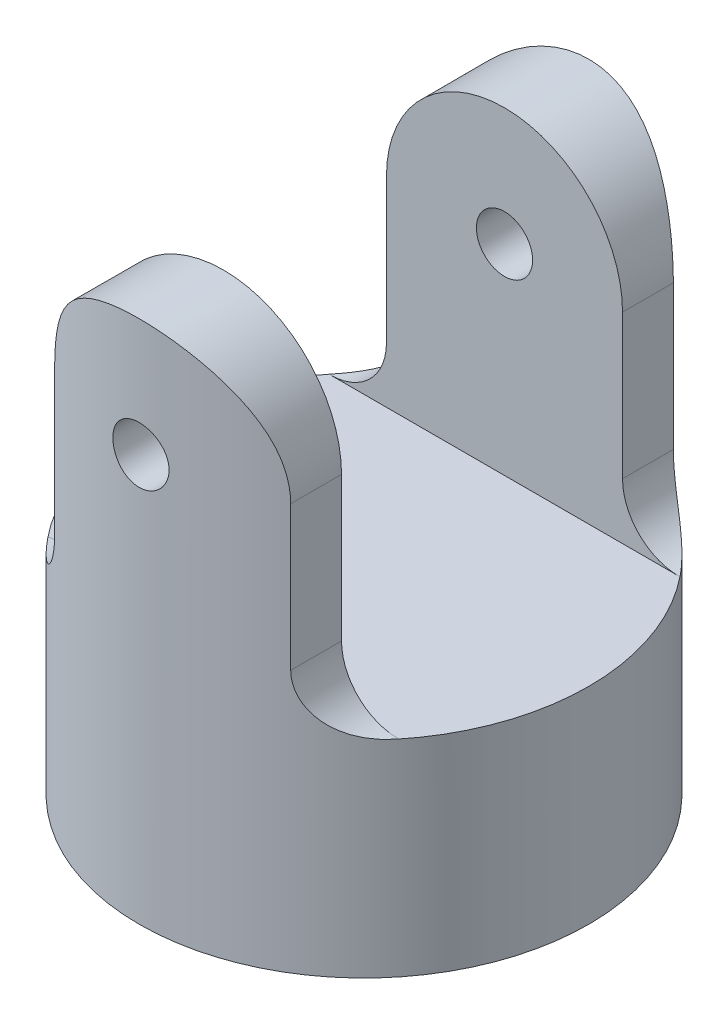
ISO-10303-21;
HEADER;
FILE_DESCRIPTION(('STEP AP214'),'2;1');
FILE_NAME('part.step','',(''),(''),'','','');
FILE_SCHEMA(('AUTOMOTIVE_DESIGN { 1 0 10303 214 1 1 1 1 }'));
ENDSEC;
DATA;
#1=APPLICATION_CONTEXT('core data for automotive mechanical design processes');
#2=APPLICATION_PROTOCOL_DEFINITION('international standard','automotive_design',2000,#1);
#3=PRODUCT_CONTEXT('',#1,'mechanical');
#4=PRODUCT('Part','Part','',(#3));
#5=PRODUCT_RELATED_PRODUCT_CATEGORY('part','',(#4));
#6=PRODUCT_DEFINITION_FORMATION('','',#4);
#7=PRODUCT_DEFINITION_CONTEXT('part definition',#1,'design');
#8=PRODUCT_DEFINITION('design','',#6,#7);
#9=PRODUCT_DEFINITION_SHAPE('','',#8);
#10=(LENGTH_UNIT() NAMED_UNIT(*) SI_UNIT(.MILLI.,.METRE.));
#11=(NAMED_UNIT(*) PLANE_ANGLE_UNIT() SI_UNIT($,.RADIAN.));
#12=(NAMED_UNIT(*) SI_UNIT($,.STERADIAN.) SOLID_ANGLE_UNIT());
#13=UNCERTAINTY_MEASURE_WITH_UNIT(LENGTH_MEASURE(1.E-05),#10,'distance_accuracy_value','');
#14=(GEOMETRIC_REPRESENTATION_CONTEXT(3) GLOBAL_UNCERTAINTY_ASSIGNED_CONTEXT((#13)) GLOBAL_UNIT_ASSIGNED_CONTEXT((#10,
#11,#12)) REPRESENTATION_CONTEXT('',''));
#15=CARTESIAN_POINT('',(0.,0.,0.));
#16=DIRECTION('',(0.,0.,1.));
#17=DIRECTION('',(1.,0.,0.));
#18=AXIS2_PLACEMENT_3D('',#15,#16,#17);
#19=CARTESIAN_POINT('',(0.,14.,0.));
#20=DIRECTION('',(0.,-1.,0.));
#21=DIRECTION('',(0.,0.,-1.));
#22=AXIS2_PLACEMENT_3D('',#19,#20,#21);
#23=CYLINDRICAL_SURFACE('',#22,6.);
#24=CARTESIAN_POINT('',(0.,11.6,-6.));
#25=CARTESIAN_POINT('',(-0.0419523286667284,11.5999982177193,-5.99999941468929));
#26=CARTESIAN_POINT('',(-0.083930872290824,11.5964681362492,-5.99955535366471));
#27=CARTESIAN_POINT('',(-0.166719840626926,11.5824416736288,-5.99782662033408));
#28=CARTESIAN_POINT('',(-0.207528999187123,11.571938018623,-5.99654107032429));
#29=CARTESIAN_POINT('',(-0.286768672443916,11.5442787068258,-5.99327418313322));
#30=CARTESIAN_POINT('',(-0.325200768043841,11.527127527457,-5.99129331436663));
#31=CARTESIAN_POINT('',(-0.39863384246791,11.4866698148091,-5.98685610263429));
#32=CARTESIAN_POINT('',(-0.433635408466911,11.4633643374408,-5.98439984125235));
#33=CARTESIAN_POINT('',(-0.499413845079395,11.4111224150481,-5.97927096391898));
#34=CARTESIAN_POINT('',(-0.530169109481138,11.3821588611961,-5.97659734407725));
#35=CARTESIAN_POINT('',(-0.586395838067248,11.319481152939,-5.97134317802925));
#36=CARTESIAN_POINT('',(-0.611867032917675,11.285766756526,-5.96876263657281));
#37=CARTESIAN_POINT('',(-0.656883048385181,11.2144040067303,-5.96397691685876));
#38=CARTESIAN_POINT('',(-0.676407628782321,11.1767427915296,-5.96177303153373));
#39=CARTESIAN_POINT('',(-0.708846922972535,11.0986438844158,-5.95800338537305));
#40=CARTESIAN_POINT('',(-0.721761887419565,11.0582062978559,-5.95643760033941));
#41=CARTESIAN_POINT('',(-0.740549694007429,10.975926741324,-5.95413101881084));
#42=CARTESIAN_POINT('',(-0.746459014419511,10.9340932226887,-5.95338595031023));
#43=CARTESIAN_POINT('',(-0.751180664867169,10.8500221209584,-5.95279208442838));
#44=CARTESIAN_POINT('',(-0.749993280300725,10.8077845541806,-5.95294325100452));
#45=CARTESIAN_POINT('',(-0.740585170934372,10.7243585518254,-5.95412086610926));
#46=CARTESIAN_POINT('',(-0.73240462889541,10.6831655041399,-5.95514231388099));
#47=CARTESIAN_POINT('',(-0.709305114954617,10.6027414936343,-5.95793759927289));
#48=CARTESIAN_POINT('',(-0.694386006525572,10.5635105705858,-5.95971145213717));
#49=CARTESIAN_POINT('',(-0.658189667973496,10.4879996002935,-5.96381734759395));
#50=CARTESIAN_POINT('',(-0.636894976112292,10.4517280099253,-5.96615091963433));
#51=CARTESIAN_POINT('',(-0.588564440837077,10.383257991676,-5.97111213429179));
#52=CARTESIAN_POINT('',(-0.561528334824234,10.3510597502079,-5.97373979035699));
#53=CARTESIAN_POINT('',(-0.502259733226135,10.2914171867832,-5.97901532967128));
#54=CARTESIAN_POINT('',(-0.469992602352005,10.2640072724702,-5.98166322716067));
#55=CARTESIAN_POINT('',(-0.401297150734178,10.2149873359908,-5.98666389766756));
#56=CARTESIAN_POINT('',(-0.364868820395477,10.1933773271984,-5.98901667000452));
#57=CARTESIAN_POINT('',(-0.288858501409046,10.1565706038608,-5.99316345665574));
#58=CARTESIAN_POINT('',(-0.249275458601317,10.1413760438356,-5.99495728320461));
#59=CARTESIAN_POINT('',(-0.168092382129319,10.117858851943,-5.99778235734018));
#60=CARTESIAN_POINT('',(-0.126492442989202,10.1095358983589,-5.99881364062761));
#61=CARTESIAN_POINT('',(-0.0427539491740512,10.1000427727218,-5.99999278923228));
#62=CARTESIAN_POINT('',(-0.000620847059584148,10.0988252022908,-6.00014650842791));
#63=CARTESIAN_POINT('',(0.0832488109492471,10.1034523202168,-5.99956901401629));
#64=CARTESIAN_POINT('',(0.12498537526941,10.1092968581755,-5.99883781925464));
#65=CARTESIAN_POINT('',(0.206737352316455,10.1278429126323,-5.99657630627008));
#66=CARTESIAN_POINT('',(0.24675797112741,10.1405218290208,-5.99504862244161));
#67=CARTESIAN_POINT('',(0.324104896457521,10.1723532355739,-5.99136516930059));
#68=CARTESIAN_POINT('',(0.361431111439593,10.1915059455474,-5.98920937866187));
#69=CARTESIAN_POINT('',(0.432541356206228,10.2358559412522,-5.98449546873034));
#70=CARTESIAN_POINT('',(0.466306127983146,10.2610838869417,-5.98193533212753));
#71=CARTESIAN_POINT('',(0.529139096887895,10.3168248492603,-5.97670542697697));
#72=CARTESIAN_POINT('',(0.558207107501057,10.3473380756753,-5.9740356540807));
#73=CARTESIAN_POINT('',(0.610989587645404,10.4129922250271,-5.96886931638775));
#74=CARTESIAN_POINT('',(0.634672638170379,10.4481585038931,-5.96637382416398));
#75=CARTESIAN_POINT('',(0.675795866833052,10.5219974734564,-5.96185623311145));
#76=CARTESIAN_POINT('',(0.693236170118511,10.560670093843,-5.95983412479308));
#77=CARTESIAN_POINT('',(0.721327973659962,10.6403225957443,-5.95649955117899));
#78=CARTESIAN_POINT('',(0.731997188237133,10.6812961490144,-5.95518523555437));
#79=CARTESIAN_POINT('',(0.746300998160354,10.7644707451342,-5.95340974772236));
#80=CARTESIAN_POINT('',(0.749935920760729,10.8066717307877,-5.95294853582633));
#81=CARTESIAN_POINT('',(0.750061960825451,10.8907906787614,-5.95293263094737));
#82=CARTESIAN_POINT('',(0.746602439309783,10.9327085744996,-5.95337167425586));
#83=CARTESIAN_POINT('',(0.732742321454799,11.0153621388035,-5.9550933436116));
#84=CARTESIAN_POINT('',(0.722341724371732,11.0560978072426,-5.95637596974924));
#85=CARTESIAN_POINT('',(0.694910122106898,11.1352240870299,-5.95963834732365));
#86=CARTESIAN_POINT('',(0.677881494291281,11.1736155335065,-5.96161784877835));
#87=CARTESIAN_POINT('',(0.637682070645095,11.2470039962145,-5.96605134973446));
#88=CARTESIAN_POINT('',(0.614511197852879,11.2820009699059,-5.96850535518124));
#89=CARTESIAN_POINT('',(0.562501899379753,11.3478593676021,-5.9736318142567));
#90=CARTESIAN_POINT('',(0.533626687732489,11.3786916382865,-5.9763056162521));
#91=CARTESIAN_POINT('',(0.471105068090516,11.4350920475504,-5.9815584947787));
#92=CARTESIAN_POINT('',(0.437457536742471,11.4606589432323,-5.98413754882677));
#93=CARTESIAN_POINT('',(0.366199686256264,11.5058856071316,-5.98892116976024));
#94=CARTESIAN_POINT('',(0.328574783878852,11.5255225417698,-5.9911242752349));
#95=CARTESIAN_POINT('',(0.250554870690385,11.5581713728749,-5.99489294723018));
#96=CARTESIAN_POINT('',(0.210162924261072,11.571190467906,-5.99645920610873));
#97=CARTESIAN_POINT('',(0.141301731590378,11.5871178014514,-5.99840016098324));
#98=CARTESIAN_POINT('',(0.113266699055077,11.5919416825946,-5.99899717768636));
#99=CARTESIAN_POINT('',(0.0568251189637309,11.598383373708,-5.99979729398757));
#100=CARTESIAN_POINT('',(0.0284185741488084,11.6000012073198,-6.00000039649041));
#101=CARTESIAN_POINT('',(0.,11.6,-6.));
#102=B_SPLINE_CURVE_WITH_KNOTS('',3,(#24,#25,#26,#27,#28,#29,#30,#31,#32,#33,#34,#35,#36,#37,
#38,#39,#40,#41,#42,#43,#44,#45,#46,#47,#48,#49,#50,#51,#52,#53,#54,#55,#56,#57,#58,#59,#60,#61,
#62,#63,#64,#65,#66,#67,#68,#69,#70,#71,#72,#73,#74,#75,#76,#77,#78,#79,#80,#81,#82,#83,#84,#85,
#86,#87,#88,#89,#90,#91,#92,#93,#94,#95,#96,#97,#98,#99,#100,#101),.UNSPECIFIED.,.T.,.F.,(4,2,2,
2,2,2,2,2,2,2,2,2,2,2,2,2,2,2,2,2,2,2,2,2,2,2,2,2,2,2,2,2,2,2,2,2,2,2,4),(0.,0.125753181832874,
0.251637738283028,0.377437652454531,0.503215996773219,0.629612439605528,0.756015323400031,
0.882843750956608,1.00966736849042,1.13582767585896,1.26198290965399,1.38741808932507,
1.51285581049872,1.6386402788566,1.76443050154092,1.89109043440925,2.01775065933934,
2.14445338719481,2.27115018271134,2.39700083817576,2.52284881350579,2.64828316168019,
2.77372176923684,2.89980720878527,3.02589765412526,3.15270591452272,3.27951163266462,
3.40598422284278,3.53245092903187,3.65804070360664,3.78363049163864,3.90917527411946,
4.03472162973679,4.16110571307549,4.28751959541004,4.41441420911056,4.5411704960521,
4.62635652956289,4.71154193490131),.UNSPECIFIED.);
#103=CARTESIAN_POINT('',(0.,11.6,-6.));
#104=VERTEX_POINT('',#103);
#105=EDGE_CURVE('E420',#104,#104,#102,.T.);
#106=ORIENTED_EDGE('',*,*,#105,.T.);
#107=EDGE_LOOP('',(#106));
#108=FACE_BOUND('',#107,.T.);
#109=CARTESIAN_POINT('',(0.75,10.85,5.95294044989533));
#110=CARTESIAN_POINT('',(0.749998216450185,10.8080491148624,5.95294105251399));
#111=CARTESIAN_POINT('',(0.746468369706386,10.7660720105286,5.95338868535683));
#112=CARTESIAN_POINT('',(0.732442924116403,10.6832860323786,5.95513017293991));
#113=CARTESIAN_POINT('',(0.721940046327389,10.6424784258509,5.95642491192888));
#114=CARTESIAN_POINT('',(0.694283007847788,10.5632420353652,5.95971172132628));
#115=CARTESIAN_POINT('',(0.677133361439472,10.5248116573644,5.96170331836095));
#116=CARTESIAN_POINT('',(0.636679259528859,10.4513814644531,5.96615887055972));
#117=CARTESIAN_POINT('',(0.613375856212438,10.4163810644771,5.96862274495285));
#118=CARTESIAN_POINT('',(0.561136035079326,10.3506013258634,5.9737606777317));
#119=CARTESIAN_POINT('',(0.53217204450729,10.3198439593043,5.97643572510613));
#120=CARTESIAN_POINT('',(0.46949257820137,10.2636131693183,5.9816856986275));
#121=CARTESIAN_POINT('',(0.435776866217411,10.2381400087716,5.98426061978815));
#122=CARTESIAN_POINT('',(0.364412949202793,10.1931219261481,5.98903033383847));
#123=CARTESIAN_POINT('',(0.326752108668336,10.1735968864701,5.99122384154042));
#124=CARTESIAN_POINT('',(0.248654015416776,10.1411566400177,5.99497271086358));
#125=CARTESIAN_POINT('',(0.208216865808272,10.128241187922,5.9965280961689));
#126=CARTESIAN_POINT('',(0.125938706325334,10.1094523794997,5.99881850611869));
#127=CARTESIAN_POINT('',(0.0841061578990132,10.1035424964428,5.99955778450782));
#128=CARTESIAN_POINT('',(3.6960205963966E-05,10.098819384489,6.00014720918765));
#129=CARTESIAN_POINT('',(-0.0421996730984312,10.1000058764142,5.99999739045624));
#130=CARTESIAN_POINT('',(-0.125629580692364,10.1094125608272,5.99882894331003));
#131=CARTESIAN_POINT('',(-0.166827361729336,10.1175934695444,5.99781516736718));
#132=CARTESIAN_POINT('',(-0.247260649171612,10.140695352989,5.995038167827));
#133=CARTESIAN_POINT('',(-0.286496118256861,10.15561645585,5.99327492998214));
#134=CARTESIAN_POINT('',(-0.362012644631591,10.1918169478351,5.98918877342374));
#135=CARTESIAN_POINT('',(-0.398285468352156,10.2131133373191,5.98686436152972));
#136=CARTESIAN_POINT('',(-0.466757235691943,10.2614475086648,5.98191590719585));
#137=CARTESIAN_POINT('',(-0.498955992365207,10.2884855538406,5.97929185101679));
#138=CARTESIAN_POINT('',(-0.558596409231884,10.3477555455795,5.97401660257054));
#139=CARTESIAN_POINT('',(-0.586004051998799,10.380021727864,5.97136534741418));
#140=CARTESIAN_POINT('',(-0.635019855187532,10.4487144670347,5.96635221582174));
#141=CARTESIAN_POINT('',(-0.656627997430529,10.4851410369614,5.96399034029274));
#142=CARTESIAN_POINT('',(-0.693433372074821,10.5611508486687,5.95982340783815));
#143=CARTESIAN_POINT('',(-0.708627878958698,10.600735423986,5.95801858772439));
#144=CARTESIAN_POINT('',(-0.732144496340427,10.681921836058,5.95517472748787));
#145=CARTESIAN_POINT('',(-0.740466938039887,10.7235235754926,5.95413565046011));
#146=CARTESIAN_POINT('',(-0.749958129572583,10.8072629545999,5.95294766635215));
#147=CARTESIAN_POINT('',(-0.751174752599486,10.8493950869266,5.95279280232713));
#148=CARTESIAN_POINT('',(-0.746546085969168,10.9332625788996,5.95337502335895));
#149=CARTESIAN_POINT('',(-0.740700946832943,10.9749979469838,5.95411208940435));
#150=CARTESIAN_POINT('',(-0.722154985739319,11.0567437290734,5.95638968545196));
#151=CARTESIAN_POINT('',(-0.709477345123819,11.0967594845571,5.95792749808398));
#152=CARTESIAN_POINT('',(-0.677650115734839,11.1740972464559,5.96163110991242));
#153=CARTESIAN_POINT('',(-0.658500299574368,11.2114191581723,5.96379693117229));
#154=CARTESIAN_POINT('',(-0.614154606646477,11.2825263931439,5.9685267940597));
#155=CARTESIAN_POINT('',(-0.588927335873132,11.3162919995943,5.97109287821125));
#156=CARTESIAN_POINT('',(-0.533187222710686,11.3791269661805,5.97632771865307));
#157=CARTESIAN_POINT('',(-0.502674174727645,11.4081961435604,5.97899647893387));
#158=CARTESIAN_POINT('',(-0.437019532667557,11.4609812562003,5.98415426606088));
#159=CARTESIAN_POINT('',(-0.40185254763511,11.4846657340385,5.98664218173756));
#160=CARTESIAN_POINT('',(-0.328011774504537,11.5257914652901,5.99114133909483));
#161=CARTESIAN_POINT('',(-0.289338057110497,11.5432328445443,5.99315259038315));
#162=CARTESIAN_POINT('',(-0.209686157741837,11.5713253360724,5.99646687195956));
#163=CARTESIAN_POINT('',(-0.168714469953534,11.5819946288095,5.99777179706312));
#164=CARTESIAN_POINT('',(-0.0855438171833887,11.596299226768,5.99953426403269));
#165=CARTESIAN_POINT('',(-0.0433449076314326,11.5999348491798,5.99999184411053));
#166=CARTESIAN_POINT('',(0.040775155003135,11.6000629766876,6.000007884041));
#167=CARTESIAN_POINT('',(0.0826962413144202,11.5966039881704,5.99957244950352));
#168=CARTESIAN_POINT('',(0.165356322435784,11.5827438159707,5.99786352347382));
#169=CARTESIAN_POINT('',(0.206095318067955,11.5723426371165,5.99659003256444));
#170=CARTESIAN_POINT('',(0.285228432896195,11.5449085656951,5.9933474556361));
#171=CARTESIAN_POINT('',(0.323623368047872,11.527877996188,5.99137861330341));
#172=CARTESIAN_POINT('',(0.397018001143208,11.4876736056177,5.98696334281884));
#173=CARTESIAN_POINT('',(0.43201765871641,11.4644997115215,5.98451690898936));
#174=CARTESIAN_POINT('',(0.497876030388768,11.4124870353991,5.97939958177674));
#175=CARTESIAN_POINT('',(0.528706136350291,11.3836121619429,5.97672732383676));
#176=CARTESIAN_POINT('',(0.585102335645804,11.3210921167913,5.97147047704062));
#177=CARTESIAN_POINT('',(0.610667180338048,11.2874458167527,5.96888590910099));
#178=CARTESIAN_POINT('',(0.655891572754811,11.2161890231908,5.96408643418406));
#179=CARTESIAN_POINT('',(0.675527934950021,11.1785637230195,5.96187299325685));
#180=CARTESIAN_POINT('',(0.708175586503007,11.1005429778216,5.95808357435887));
#181=CARTESIAN_POINT('',(0.721194081368495,11.060150600209,5.95650690346163));
#182=CARTESIAN_POINT('',(0.737119768871394,10.9912910038869,5.95455236045953));
#183=CARTESIAN_POINT('',(0.741942909303174,10.9632581145387,5.95395090456573));
#184=CARTESIAN_POINT('',(0.748383616771654,10.9068208250099,5.95314474668974));
#185=CARTESIAN_POINT('',(0.750001208129796,10.8784164276497,5.95294004169728));
#186=CARTESIAN_POINT('',(0.75,10.85,5.95294044989533));
#187=B_SPLINE_CURVE_WITH_KNOTS('',3,(#109,#110,#111,#112,#113,#114,#115,#116,#117,#118,#119,
#120,#121,#122,#123,#124,#125,#126,#127,#128,#129,#130,#131,#132,#133,#134,#135,#136,#137,#138,
#139,#140,#141,#142,#143,#144,#145,#146,#147,#148,#149,#150,#151,#152,#153,#154,#155,#156,#157,
#158,#159,#160,#161,#162,#163,#164,#165,#166,#167,#168,#169,#170,#171,#172,#173,#174,#175,#176,
#177,#178,#179,#180,#181,#182,#183,#184,#185,#186),.UNSPECIFIED.,.T.,.F.,(4,2,2,2,2,2,2,2,2,2,2,
2,2,2,2,2,2,2,2,2,2,2,2,2,2,2,2,2,2,2,2,2,2,2,2,2,2,2,4),(0.,0.125748845243773,
0.251629162845714,0.377424135774361,0.503197613851839,0.629599732647197,0.756008138227736,
0.882834558437222,1.00965627101949,1.13581379082437,1.26196634751033,1.38741499479912,
1.51286602701537,1.63865461323841,1.76444896940732,1.89110309213331,2.01775761185828,
2.14446590021703,2.27116808146857,2.39701565341765,2.52286054298135,2.6482811288782,
2.77370612163556,2.89979345863234,3.02588570098444,3.15269665767703,3.27950505812664,
3.40597157035483,3.53243237931844,3.65803144886477,3.78363043106037,3.90918544063227,
4.03474194289275,4.16112038667251,4.28752876631949,4.41442529311451,4.54118335794605,
4.62636296889885,4.71154193356643),.UNSPECIFIED.);
#188=CARTESIAN_POINT('',(0.75,10.85,5.95294044989533));
#189=VERTEX_POINT('',#188);
#190=EDGE_CURVE('E424',#189,#189,#187,.T.);
#191=ORIENTED_EDGE('',*,*,#190,.T.);
#192=EDGE_LOOP('',(#191));
#193=FACE_BOUND('',#192,.T.);
#194=CARTESIAN_POINT('',(0.,0.,0.));
#195=DIRECTION('',(0.,1.,0.));
#196=DIRECTION('',(0.,0.,1.));
#197=AXIS2_PLACEMENT_3D('',#194,#195,#196);
#198=CIRCLE('',#197,6.);
#199=CARTESIAN_POINT('',(0.,0.,6.));
#200=VERTEX_POINT('',#199);
#201=EDGE_CURVE('E299',#200,#200,#198,.T.);
#202=ORIENTED_EDGE('',*,*,#201,.T.);
#203=EDGE_LOOP('',(#202));
#204=FACE_BOUND('',#203,.T.);
#205=DIRECTION('',(0.,-1.,0.));
#206=VECTOR('',#205,1.);
#207=CARTESIAN_POINT('',(3.15,14.,5.10661335916476));
#208=LINE('',#207,#206);
#209=CARTESIAN_POINT('',(3.15,7.,5.10661335916476));
#210=VERTEX_POINT('',#209);
#211=CARTESIAN_POINT('',(3.15,10.85,5.10661335916476));
#212=VERTEX_POINT('',#211);
#213=EDGE_CURVE('E507',#210,#212,#208,.F.);
#214=ORIENTED_EDGE('',*,*,#213,.T.);
#215=CARTESIAN_POINT('',(-3.15,10.85,5.10661335916476));
#216=CARTESIAN_POINT('',(-3.15001553002084,10.9318443388245,5.10658703577101));
#217=CARTESIAN_POINT('',(-3.14681080311421,11.0136738935938,5.10858027393052));
#218=CARTESIAN_POINT('',(-3.13408333051764,11.1766004389433,5.11640719891283));
#219=CARTESIAN_POINT('',(-3.12456494224072,11.2576978956861,5.12223823703237));
#220=CARTESIAN_POINT('',(-3.09941129771566,11.4180684460604,5.13749469977293));
#221=CARTESIAN_POINT('',(-3.08381469855571,11.497349781216,5.14689739944555));
#222=CARTESIAN_POINT('',(-3.04671961340923,11.6540457720237,5.16894231740933));
#223=CARTESIAN_POINT('',(-3.02522034518324,11.7314601787846,5.18158496505335));
#224=CARTESIAN_POINT('',(-2.95234161540175,11.9597807100791,5.22368063689342));
#225=CARTESIAN_POINT('',(-2.89249523906496,12.1072997580038,5.25735699715152));
#226=CARTESIAN_POINT('',(-2.75227012458837,12.3903107021859,5.33210115263615));
#227=CARTESIAN_POINT('',(-2.67185636557233,12.5257815479197,5.3731815193601));
#228=CARTESIAN_POINT('',(-2.48426131666499,12.7942528188555,5.46261697540076));
#229=CARTESIAN_POINT('',(-2.37531378013408,12.9259148282154,5.51129393549107));
#230=CARTESIAN_POINT('',(-2.13741480448213,13.1701380302645,5.60784635148983));
#231=CARTESIAN_POINT('',(-2.00845558989099,13.2826917627498,5.65572148780744));
#232=CARTESIAN_POINT('',(-1.7221463918038,13.4939979211784,5.74966008199784));
#233=CARTESIAN_POINT('',(-1.56337820302334,13.59103221782,5.79530369790322));
#234=CARTESIAN_POINT('',(-1.22897787540046,13.7563342294409,5.87528959670535));
#235=CARTESIAN_POINT('',(-1.05336794372831,13.8246392029279,5.90964650437023));
#236=CARTESIAN_POINT('',(-0.73140697805043,13.9174093608546,5.95695505939261));
#237=CARTESIAN_POINT('',(-0.587328277345295,13.9482713752362,5.97297940374148));
#238=CARTESIAN_POINT('',(-0.295507664434141,13.9895648452487,5.99450156423869));
#239=CARTESIAN_POINT('',(-0.147767001522723,14.0000031739484,6.00000292161505));
#240=CARTESIAN_POINT('',(0.164759691019966,13.9999964610586,5.99999674240941));
#241=CARTESIAN_POINT('',(0.329552126654997,13.9870118662458,5.9931504704054));
#242=CARTESIAN_POINT('',(0.65408822824119,13.9357248058426,5.96646706979477));
#243=CARTESIAN_POINT('',(0.813829098422247,13.8974085688916,5.94662287501759));
#244=CARTESIAN_POINT('',(1.12326060110906,13.7973961589254,5.89599861004652));
#245=CARTESIAN_POINT('',(1.2729848633699,13.73578337352,5.86525756825403));
#246=CARTESIAN_POINT('',(1.5597499251547,13.5914373996009,5.79560061773275));
#247=CARTESIAN_POINT('',(1.69678816942931,13.5086999686662,5.75668306721018));
#248=CARTESIAN_POINT('',(1.96419830400532,13.3184125562187,5.67123253638535));
#249=CARTESIAN_POINT('',(2.09356966104835,13.2096061180456,5.62437022070837));
#250=CARTESIAN_POINT('',(2.33317673358948,12.9730177198398,5.52928014224933));
#251=CARTESIAN_POINT('',(2.44339321635684,12.845216924315,5.48105106299942));
#252=CARTESIAN_POINT('',(2.6514000556695,12.5606286766576,5.383716595244));
#253=CARTESIAN_POINT('',(2.74722846957303,12.4022770751967,5.33491115270673));
#254=CARTESIAN_POINT('',(2.86954536054654,12.1526162879673,5.26952096643093));
#255=CARTESIAN_POINT('',(2.90673442847147,12.0674160682662,5.24903491647991));
#256=CARTESIAN_POINT('',(2.97362137561426,11.8934279427068,5.21143427093687));
#257=CARTESIAN_POINT('',(3.00332450379462,11.804642601615,5.19431731487129));
#258=CARTESIAN_POINT('',(3.04889636393431,11.6449537327203,5.16766463835895));
#259=CARTESIAN_POINT('',(3.06637577872563,11.5746438888478,5.15729084789584));
#260=CARTESIAN_POINT('',(3.09649309751131,11.4326614371657,5.13926426633043));
#261=CARTESIAN_POINT('',(3.10913225928512,11.3609891884763,5.13161076837501));
#262=CARTESIAN_POINT('',(3.12947653059023,11.2163707312505,5.11923117002799));
#263=CARTESIAN_POINT('',(3.13715965309605,11.1434203007247,5.11451811764942));
#264=CARTESIAN_POINT('',(3.14742824773799,10.996982856906,5.10819947195366));
#265=CARTESIAN_POINT('',(3.15001051379385,10.9234955352593,5.10659583303151));
#266=CARTESIAN_POINT('',(3.15,10.85,5.10661335916476));
#267=B_SPLINE_CURVE_WITH_KNOTS('',3,(#215,#216,#217,#218,#219,#220,#221,#222,#223,#224,#225,
#226,#227,#228,#229,#230,#231,#232,#233,#234,#235,#236,#237,#238,#239,#240,#241,#242,#243,#244,
#245,#246,#247,#248,#249,#250,#251,#252,#253,#254,#255,#256,#257,#258,#259,#260,#261,#262,#263,
#264,#265,#266),.UNSPECIFIED.,.F.,.F.,(4,2,2,2,2,2,2,2,2,2,2,2,2,2,2,2,2,2,2,2,2,2,2,2,2,4),(0.,
0.245421879371357,0.49067455528182,0.734392244722035,0.978142247966399,1.4640269496978,
1.95074455878845,2.48160563988349,3.01267350412188,3.58443029159324,4.15544327510846,
4.59837709701002,5.04116183521385,5.53486527307917,6.02883733012883,6.52105775049214,
7.01337710037425,7.53745994706819,8.06206600425766,8.63308306150028,8.91832743743151,
9.20337124684027,9.42273405125346,9.64203981369968,9.86231193423527,10.0827224600912),.UNSPECIFIED.);
#268=CARTESIAN_POINT('',(-3.15,10.85,5.10661335916476));
#269=VERTEX_POINT('',#268);
#270=EDGE_CURVE('E369',#269,#212,#267,.T.);
#271=ORIENTED_EDGE('',*,*,#270,.F.);
#272=DIRECTION('',(0.,-1.,0.));
#273=VECTOR('',#272,1.);
#274=CARTESIAN_POINT('',(-3.15,14.,5.10661335916476));
#275=LINE('',#274,#273);
#276=CARTESIAN_POINT('',(-3.15,7.,5.10661335916476));
#277=VERTEX_POINT('',#276);
#278=EDGE_CURVE('E484',#277,#269,#275,.F.);
#279=ORIENTED_EDGE('',*,*,#278,.F.);
#280=CARTESIAN_POINT('',(-4.65,5.5,3.79176739792937));
#281=CARTESIAN_POINT('',(-4.61025024886713,5.50000505502143,3.84052264466323));
#282=CARTESIAN_POINT('',(-4.56971135136197,5.50158113093704,3.88866330483559));
#283=CARTESIAN_POINT('',(-4.48721162436453,5.50828282097174,3.98357565065952));
#284=CARTESIAN_POINT('',(-4.44524879389684,5.51341364497822,4.03034522182074));
#285=CARTESIAN_POINT('',(-4.35977336898431,5.52770192556706,4.12266557630679));
#286=CARTESIAN_POINT('',(-4.31624987207917,5.53689699940651,4.16820065272348));
#287=CARTESIAN_POINT('',(-4.22840820918457,5.55975001035176,4.25728558066949));
#288=CARTESIAN_POINT('',(-4.18409051279939,5.57340538738272,4.30083655471097));
#289=CARTESIAN_POINT('',(-4.06769735166872,5.61552812753565,4.41176309167763));
#290=CARTESIAN_POINT('',(-3.99527721937651,5.64794268631255,4.47735841073511));
#291=CARTESIAN_POINT('',(-3.85223243422571,5.72712455569309,4.60100005425677));
#292=CARTESIAN_POINT('',(-3.78160209125706,5.77383787320525,4.65907362691965));
#293=CARTESIAN_POINT('',(-3.65642942793946,5.87387194781858,4.75771312019591));
#294=CARTESIAN_POINT('',(-3.60112436774485,5.92492908563286,4.79959304083452));
#295=CARTESIAN_POINT('',(-3.49671343333686,6.03779782368283,4.87618592266318));
#296=CARTESIAN_POINT('',(-3.44760920237236,6.0996122643766,4.91089698561452));
#297=CARTESIAN_POINT('',(-3.35813583684684,6.23344670252593,4.9725151149369));
#298=CARTESIAN_POINT('',(-3.31782360954412,6.30552846820399,4.9993717025862));
#299=CARTESIAN_POINT('',(-3.24901777577134,6.45760289701596,5.04436237292911));
#300=CARTESIAN_POINT('',(-3.22051198875959,6.5375873010258,5.06250544833329));
#301=CARTESIAN_POINT('',(-3.18282960243452,6.68149030129627,5.08625125431837));
#302=CARTESIAN_POINT('',(-3.17057352429694,6.74428323585802,5.09387485050384));
#303=CARTESIAN_POINT('',(-3.15825960186224,6.83956221806216,5.10151129896761));
#304=CARTESIAN_POINT('',(-3.15516661929031,6.87153155015716,5.10342362956596));
#305=CARTESIAN_POINT('',(-3.15103539018376,6.93566390418063,5.10597479614617));
#306=CARTESIAN_POINT('',(-3.14999783000953,6.96782698721281,5.10661320673266));
#307=CARTESIAN_POINT('',(-3.15,7.,5.10661335916476));
#308=B_SPLINE_CURVE_WITH_KNOTS('',3,(#280,#281,#282,#283,#284,#285,#286,#287,#288,#289,#290,
#291,#292,#293,#294,#295,#296,#297,#298,#299,#300,#301,#302,#303,#304,#305,#306,#307),
.UNSPECIFIED.,.F.,.F.,(4,2,2,2,2,2,2,2,2,2,2,2,2,4),(0.,0.188722079357418,0.37772133911088,
0.56850778533463,0.759184917954158,1.06687347175063,1.37341421343889,1.63075830933157,
1.88817046013699,2.14720230410206,2.40596623877581,2.59852144812183,2.69496573904503,
2.79144222986584),.UNSPECIFIED.);
#309=CARTESIAN_POINT('',(-4.65,5.5,3.79176739792937));
#310=VERTEX_POINT('',#309);
#311=EDGE_CURVE('E379',#310,#277,#308,.T.);
#312=ORIENTED_EDGE('',*,*,#311,.F.);
#313=CARTESIAN_POINT('',(0.,5.5,0.));
#314=DIRECTION('',(0.,-1.,0.));
#315=DIRECTION('',(0.,0.,-1.));
#316=AXIS2_PLACEMENT_3D('',#313,#314,#315);
#317=CIRCLE('',#316,6.);
#318=CARTESIAN_POINT('',(-4.65,5.5,-3.79176739792937));
#319=VERTEX_POINT('',#318);
#320=EDGE_CURVE('E298',#310,#319,#317,.T.);
#321=ORIENTED_EDGE('',*,*,#320,.T.);
#322=CARTESIAN_POINT('',(-3.15,7.,-5.10661335916476));
#323=CARTESIAN_POINT('',(-3.14999780834655,6.96298303009159,-5.10661222326606));
#324=CARTESIAN_POINT('',(-3.15137138242597,6.92598483646073,-5.10576768356205));
#325=CARTESIAN_POINT('',(-3.1568346345037,6.8522748584558,-5.10239262341066));
#326=CARTESIAN_POINT('',(-3.16092372561908,6.81556301392955,-5.09986246726168));
#327=CARTESIAN_POINT('',(-3.17716676320046,6.7065101717919,-5.08977240302355));
#328=CARTESIAN_POINT('',(-3.19329713473406,6.63493912585256,-5.07971282028358));
#329=CARTESIAN_POINT('',(-3.23531208802413,6.49608734220827,-5.05305498849073));
#330=CARTESIAN_POINT('',(-3.2611939676888,6.42880542204194,-5.03645855070836));
#331=CARTESIAN_POINT('',(-3.3213913394497,6.30010945604738,-4.99696412902207));
#332=CARTESIAN_POINT('',(-3.35571016417759,6.23869774232268,-4.97406365456591));
#333=CARTESIAN_POINT('',(-3.43238997017879,6.1210692067444,-4.92147565860712));
#334=CARTESIAN_POINT('',(-3.47497993079355,6.06509223588734,-4.89158822501376));
#335=CARTESIAN_POINT('',(-3.56546865444763,5.96147739834132,-4.8260289581596));
#336=CARTESIAN_POINT('',(-3.61336892948569,5.91384191672384,-4.79035547609925));
#337=CARTESIAN_POINT('',(-3.71858623219524,5.82190053723288,-4.70924908157702));
#338=CARTESIAN_POINT('',(-3.7763431431514,5.77868270912248,-4.66315852837417));
#339=CARTESIAN_POINT('',(-3.89393071130699,5.70258889959621,-4.56543286188318));
#340=CARTESIAN_POINT('',(-3.95376323797279,5.66972252491345,-4.51379265745535));
#341=CARTESIAN_POINT('',(-4.10733776476408,5.59778581150743,-4.37556241012333));
#342=CARTESIAN_POINT('',(-4.2012763581353,5.56557515749524,-4.28561504427405));
#343=CARTESIAN_POINT('',(-4.38512761539899,5.52053041100723,-4.09732399638263));
#344=CARTESIAN_POINT('',(-4.47503657270457,5.50771381669729,-3.99897281645953));
#345=CARTESIAN_POINT('',(-4.57656709603125,5.501724153555,-3.88015050461646));
#346=CARTESIAN_POINT('',(-4.59141150698354,5.50107218267973,-3.86257329657688));
#347=CARTESIAN_POINT('',(-4.62086983051796,5.50021051875449,-3.82728187584622));
#348=CARTESIAN_POINT('',(-4.63548418007753,5.49999985124794,-3.80956805188534));
#349=CARTESIAN_POINT('',(-4.65,5.5,-3.79176739792937));
#350=B_SPLINE_CURVE_WITH_KNOTS('',3,(#322,#323,#324,#325,#326,#327,#328,#329,#330,#331,#332,
#333,#334,#335,#336,#337,#338,#339,#340,#341,#342,#343,#344,#345,#346,#347,#348,#349),
.UNSPECIFIED.,.F.,.F.,(4,2,2,2,2,2,2,2,2,2,2,2,2,4),(0.,0.110978956579974,0.221933935970424,
0.442918271044081,0.66384141749708,0.88485197020829,1.11319268618502,1.34159858510416,
1.59745291490793,1.85354399703677,2.25327186631472,2.65336017290771,2.72240802981286,
2.79130325844606),.UNSPECIFIED.);
#351=CARTESIAN_POINT('',(-3.15,7.,-5.10661335916476));
#352=VERTEX_POINT('',#351);
#353=EDGE_CURVE('E386',#352,#319,#350,.T.);
#354=ORIENTED_EDGE('',*,*,#353,.F.);
#355=DIRECTION('',(0.,-1.,0.));
#356=VECTOR('',#355,1.);
#357=CARTESIAN_POINT('',(-3.15,14.,-5.10661335916476));
#358=LINE('',#357,#356);
#359=CARTESIAN_POINT('',(-3.15,10.85,-5.10661335916476));
#360=VERTEX_POINT('',#359);
#361=EDGE_CURVE('E452',#360,#352,#358,.T.);
#362=ORIENTED_EDGE('',*,*,#361,.F.);
#363=CARTESIAN_POINT('',(3.15,10.85,-5.10661335916476));
#364=CARTESIAN_POINT('',(3.15001553002084,10.9318443388245,-5.10658703577101));
#365=CARTESIAN_POINT('',(3.14681080311421,11.0136738935938,-5.10858027393052));
#366=CARTESIAN_POINT('',(3.13408333051764,11.1766004389433,-5.11640719891283));
#367=CARTESIAN_POINT('',(3.12456494224072,11.2576978956861,-5.12223823703237));
#368=CARTESIAN_POINT('',(3.09941129771566,11.4180684460604,-5.13749469977293));
#369=CARTESIAN_POINT('',(3.08381469855571,11.497349781216,-5.14689739944555));
#370=CARTESIAN_POINT('',(3.04671961340923,11.6540457720237,-5.16894231740933));
#371=CARTESIAN_POINT('',(3.02522034518324,11.7314601787846,-5.18158496505335));
#372=CARTESIAN_POINT('',(2.95234161540175,11.9597807100791,-5.22368063689342));
#373=CARTESIAN_POINT('',(2.89249523906496,12.1072997580038,-5.25735699715152));
#374=CARTESIAN_POINT('',(2.75227012458837,12.3903107021859,-5.33210115263615));
#375=CARTESIAN_POINT('',(2.67185636557233,12.5257815479197,-5.3731815193601));
#376=CARTESIAN_POINT('',(2.48426131666499,12.7942528188555,-5.46261697540076));
#377=CARTESIAN_POINT('',(2.37531378013408,12.9259148282154,-5.51129393549107));
#378=CARTESIAN_POINT('',(2.13741480448212,13.1701380302645,-5.60784635148983));
#379=CARTESIAN_POINT('',(2.00845558989099,13.2826917627498,-5.65572148780744));
#380=CARTESIAN_POINT('',(1.72214639180379,13.4939979211784,-5.74966008199784));
#381=CARTESIAN_POINT('',(1.56337820302334,13.59103221782,-5.79530369790322));
#382=CARTESIAN_POINT('',(1.22897787540046,13.7563342294409,-5.87528959670535));
#383=CARTESIAN_POINT('',(1.0533679437283,13.8246392029279,-5.90964650437023));
#384=CARTESIAN_POINT('',(0.73140697805043,13.9174093608546,-5.95695505939261));
#385=CARTESIAN_POINT('',(0.587328277345295,13.9482713752362,-5.97297940374148));
#386=CARTESIAN_POINT('',(0.295507664434141,13.9895648452487,-5.99450156423869));
#387=CARTESIAN_POINT('',(0.147767001522723,14.0000031739484,-6.00000292161505));
#388=CARTESIAN_POINT('',(-0.164759691019965,13.9999964610586,-5.99999674240941));
#389=CARTESIAN_POINT('',(-0.329552126654997,13.9870118662458,-5.9931504704054));
#390=CARTESIAN_POINT('',(-0.65408822824119,13.9357248058426,-5.96646706979477));
#391=CARTESIAN_POINT('',(-0.813829098422246,13.8974085688916,-5.94662287501759));
#392=CARTESIAN_POINT('',(-1.12326060110906,13.7973961589254,-5.89599861004652));
#393=CARTESIAN_POINT('',(-1.2729848633699,13.73578337352,-5.86525756825403));
#394=CARTESIAN_POINT('',(-1.5597499251547,13.5914373996009,-5.79560061773275));
#395=CARTESIAN_POINT('',(-1.69678816942931,13.5086999686662,-5.75668306721018));
#396=CARTESIAN_POINT('',(-1.96419830400532,13.3184125562187,-5.67123253638535));
#397=CARTESIAN_POINT('',(-2.09356966104835,13.2096061180456,-5.62437022070838));
#398=CARTESIAN_POINT('',(-2.33317673358948,12.9730177198398,-5.52928014224933));
#399=CARTESIAN_POINT('',(-2.44339321635684,12.845216924315,-5.48105106299942));
#400=CARTESIAN_POINT('',(-2.6514000556695,12.5606286766576,-5.383716595244));
#401=CARTESIAN_POINT('',(-2.74722846957303,12.4022770751967,-5.33491115270673));
#402=CARTESIAN_POINT('',(-2.86954536054654,12.1526162879673,-5.26952096643093));
#403=CARTESIAN_POINT('',(-2.90673442847147,12.0674160682662,-5.24903491647991));
#404=CARTESIAN_POINT('',(-2.97362137561426,11.8934279427068,-5.21143427093687));
#405=CARTESIAN_POINT('',(-3.00332450379462,11.804642601615,-5.19431731487129));
#406=CARTESIAN_POINT('',(-3.04889636393431,11.6449537327203,-5.16766463835895));
#407=CARTESIAN_POINT('',(-3.06637577872563,11.5746438888478,-5.15729084789584));
#408=CARTESIAN_POINT('',(-3.09649309751131,11.4326614371657,-5.13926426633043));
#409=CARTESIAN_POINT('',(-3.10913225928512,11.3609891884763,-5.13161076837501));
#410=CARTESIAN_POINT('',(-3.12947653059023,11.2163707312505,-5.11923117002799));
#411=CARTESIAN_POINT('',(-3.13715965309605,11.1434203007247,-5.11451811764942));
#412=CARTESIAN_POINT('',(-3.14742824773799,10.996982856906,-5.10819947195366));
#413=CARTESIAN_POINT('',(-3.15001051379385,10.9234955352593,-5.10659583303151));
#414=CARTESIAN_POINT('',(-3.15,10.85,-5.10661335916476));
#415=B_SPLINE_CURVE_WITH_KNOTS('',3,(#363,#364,#365,#366,#367,#368,#369,#370,#371,#372,#373,
#374,#375,#376,#377,#378,#379,#380,#381,#382,#383,#384,#385,#386,#387,#388,#389,#390,#391,#392,
#393,#394,#395,#396,#397,#398,#399,#400,#401,#402,#403,#404,#405,#406,#407,#408,#409,#410,#411,
#412,#413,#414),.UNSPECIFIED.,.F.,.F.,(4,2,2,2,2,2,2,2,2,2,2,2,2,2,2,2,2,2,2,2,2,2,2,2,2,4),(0.,
0.245421879371357,0.49067455528182,0.734392244722035,0.978142247966399,1.4640269496978,
1.95074455878845,2.48160563988349,3.01267350412188,3.58443029159324,4.15544327510846,
4.59837709701002,5.04116183521385,5.53486527307917,6.02883733012883,6.52105775049214,
7.01337710037425,7.53745994706819,8.06206600425766,8.63308306150027,8.91832743743151,
9.20337124684026,9.42273405125346,9.64203981369967,9.86231193423527,10.0827224600912),.UNSPECIFIED.);
#416=CARTESIAN_POINT('',(3.15,10.85,-5.10661335916476));
#417=VERTEX_POINT('',#416);
#418=EDGE_CURVE('E362',#417,#360,#415,.T.);
#419=ORIENTED_EDGE('',*,*,#418,.F.);
#420=DIRECTION('',(0.,-1.,0.));
#421=VECTOR('',#420,1.);
#422=CARTESIAN_POINT('',(3.15,14.,-5.10661335916476));
#423=LINE('',#422,#421);
#424=CARTESIAN_POINT('',(3.15,7.,-5.10661335916476));
#425=VERTEX_POINT('',#424);
#426=EDGE_CURVE('E314',#417,#425,#423,.T.);
#427=ORIENTED_EDGE('',*,*,#426,.T.);
#428=CARTESIAN_POINT('',(3.15,7.,-5.10661335916476));
#429=CARTESIAN_POINT('',(3.14999780834655,6.96298303009159,-5.10661222326606));
#430=CARTESIAN_POINT('',(3.15137138242597,6.92598483646073,-5.10576768356205));
#431=CARTESIAN_POINT('',(3.1568346345037,6.8522748584558,-5.10239262341066));
#432=CARTESIAN_POINT('',(3.16092372561908,6.81556301392955,-5.09986246726168));
#433=CARTESIAN_POINT('',(3.17716676320046,6.7065101717919,-5.08977240302355));
#434=CARTESIAN_POINT('',(3.19329713473406,6.63493912585256,-5.07971282028358));
#435=CARTESIAN_POINT('',(3.23531208802413,6.49608734220827,-5.05305498849073));
#436=CARTESIAN_POINT('',(3.2611939676888,6.42880542204194,-5.03645855070836));
#437=CARTESIAN_POINT('',(3.3213913394497,6.30010945604738,-4.99696412902207));
#438=CARTESIAN_POINT('',(3.35571016417759,6.23869774232268,-4.97406365456591));
#439=CARTESIAN_POINT('',(3.43238997017879,6.1210692067444,-4.92147565860712));
#440=CARTESIAN_POINT('',(3.47497993079355,6.06509223588734,-4.89158822501376));
#441=CARTESIAN_POINT('',(3.56546865444763,5.96147739834132,-4.8260289581596));
#442=CARTESIAN_POINT('',(3.61336892948569,5.91384191672384,-4.79035547609925));
#443=CARTESIAN_POINT('',(3.71858623219524,5.82190053723288,-4.70924908157702));
#444=CARTESIAN_POINT('',(3.7763431431514,5.77868270912248,-4.66315852837417));
#445=CARTESIAN_POINT('',(3.89393071130699,5.70258889959621,-4.56543286188318));
#446=CARTESIAN_POINT('',(3.95376323797279,5.66972252491345,-4.51379265745535));
#447=CARTESIAN_POINT('',(4.10733776476408,5.59778581150743,-4.37556241012333));
#448=CARTESIAN_POINT('',(4.2012763581353,5.56557515749524,-4.28561504427405));
#449=CARTESIAN_POINT('',(4.38512761539899,5.52053041100723,-4.09732399638263));
#450=CARTESIAN_POINT('',(4.47503657270457,5.50771381669729,-3.99897281645953));
#451=CARTESIAN_POINT('',(4.57656709603125,5.501724153555,-3.88015050461646));
#452=CARTESIAN_POINT('',(4.59141150698354,5.50107218267973,-3.86257329657688));
#453=CARTESIAN_POINT('',(4.62086983051796,5.50021051875449,-3.82728187584622));
#454=CARTESIAN_POINT('',(4.63548418007753,5.49999985124794,-3.80956805188534));
#455=CARTESIAN_POINT('',(4.65,5.5,-3.79176739792937));
#456=B_SPLINE_CURVE_WITH_KNOTS('',3,(#428,#429,#430,#431,#432,#433,#434,#435,#436,#437,#438,
#439,#440,#441,#442,#443,#444,#445,#446,#447,#448,#449,#450,#451,#452,#453,#454,#455),
.UNSPECIFIED.,.F.,.F.,(4,2,2,2,2,2,2,2,2,2,2,2,2,4),(0.,0.110978956579974,0.221933935970424,
0.442918271044081,0.66384141749708,0.88485197020829,1.11319268618502,1.34159858510416,
1.59745291490793,1.85354399703677,2.25327186631472,2.65336017290771,2.72240802981286,
2.79130325844606),.UNSPECIFIED.);
#457=CARTESIAN_POINT('',(4.65,5.5,-3.79176739792937));
#458=VERTEX_POINT('',#457);
#459=EDGE_CURVE('E304',#425,#458,#456,.T.);
#460=ORIENTED_EDGE('',*,*,#459,.T.);
#461=CARTESIAN_POINT('',(4.65,5.5,3.79176739792937));
#462=VERTEX_POINT('',#461);
#463=EDGE_CURVE('E285',#458,#462,#317,.T.);
#464=ORIENTED_EDGE('',*,*,#463,.T.);
#465=CARTESIAN_POINT('',(4.65,5.5,3.79176739792937));
#466=CARTESIAN_POINT('',(4.61025024886713,5.50000505502143,3.84052264466323));
#467=CARTESIAN_POINT('',(4.56971135136197,5.50158113093704,3.88866330483559));
#468=CARTESIAN_POINT('',(4.48721162436453,5.50828282097174,3.98357565065952));
#469=CARTESIAN_POINT('',(4.44524879389684,5.51341364497822,4.03034522182074));
#470=CARTESIAN_POINT('',(4.35977336898431,5.52770192556706,4.12266557630679));
#471=CARTESIAN_POINT('',(4.31624987207917,5.53689699940651,4.16820065272348));
#472=CARTESIAN_POINT('',(4.22840820918457,5.55975001035176,4.25728558066949));
#473=CARTESIAN_POINT('',(4.18409051279939,5.57340538738272,4.30083655471097));
#474=CARTESIAN_POINT('',(4.06769735166872,5.61552812753565,4.41176309167763));
#475=CARTESIAN_POINT('',(3.99527721937651,5.64794268631255,4.47735841073511));
#476=CARTESIAN_POINT('',(3.85223243422571,5.72712455569309,4.60100005425677));
#477=CARTESIAN_POINT('',(3.78160209125706,5.77383787320525,4.65907362691965));
#478=CARTESIAN_POINT('',(3.65642942793946,5.87387194781858,4.75771312019591));
#479=CARTESIAN_POINT('',(3.60112436774485,5.92492908563286,4.79959304083452));
#480=CARTESIAN_POINT('',(3.49671343333686,6.03779782368283,4.87618592266318));
#481=CARTESIAN_POINT('',(3.44760920237236,6.0996122643766,4.91089698561452));
#482=CARTESIAN_POINT('',(3.35813583684684,6.23344670252593,4.9725151149369));
#483=CARTESIAN_POINT('',(3.31782360954412,6.30552846820399,4.9993717025862));
#484=CARTESIAN_POINT('',(3.24901777577134,6.45760289701596,5.04436237292911));
#485=CARTESIAN_POINT('',(3.22051198875959,6.5375873010258,5.06250544833329));
#486=CARTESIAN_POINT('',(3.18282960243452,6.68149030129627,5.08625125431837));
#487=CARTESIAN_POINT('',(3.17057352429694,6.74428323585802,5.09387485050384));
#488=CARTESIAN_POINT('',(3.15825960186224,6.83956221806216,5.10151129896761));
#489=CARTESIAN_POINT('',(3.15516661929031,6.87153155015716,5.10342362956596));
#490=CARTESIAN_POINT('',(3.15103539018376,6.93566390418063,5.10597479614617));
#491=CARTESIAN_POINT('',(3.14999783000953,6.96782698721281,5.10661320673266));
#492=CARTESIAN_POINT('',(3.15,7.,5.10661335916476));
#493=B_SPLINE_CURVE_WITH_KNOTS('',3,(#465,#466,#467,#468,#469,#470,#471,#472,#473,#474,#475,
#476,#477,#478,#479,#480,#481,#482,#483,#484,#485,#486,#487,#488,#489,#490,#491,#492),
.UNSPECIFIED.,.F.,.F.,(4,2,2,2,2,2,2,2,2,2,2,2,2,4),(0.,0.188722079357418,0.37772133911088,
0.56850778533463,0.759184917954158,1.06687347175063,1.37341421343889,1.63075830933157,
1.88817046013699,2.14720230410206,2.40596623877581,2.59852144812183,2.69496573904503,
2.79144222986584),.UNSPECIFIED.);
#494=EDGE_CURVE('E316',#462,#210,#493,.T.);
#495=ORIENTED_EDGE('',*,*,#494,.T.);
#496=EDGE_LOOP('',(#214,#271,#279,#312,#321,#354,#362,#419,#427,#460,#464,#495));
#497=FACE_BOUND('',#496,.T.);
#498=ADVANCED_FACE('F195',(#108,#193,#204,#497),#23,.T.);
#499=CARTESIAN_POINT('',(-6.,14.,3.75));
#500=DIRECTION('',(0.,0.,1.));
#501=DIRECTION('',(1.,0.,0.));
#502=AXIS2_PLACEMENT_3D('',#499,#500,#501);
#503=PLANE('',#502);
#504=CARTESIAN_POINT('',(0.,10.85,3.75));
#505=DIRECTION('',(0.,0.,1.));
#506=DIRECTION('',(1.,0.,0.));
#507=AXIS2_PLACEMENT_3D('',#504,#505,#506);
#508=CIRCLE('',#507,0.75);
#509=CARTESIAN_POINT('',(0.75,10.85,3.75));
#510=VERTEX_POINT('',#509);
#511=EDGE_CURVE('E518',#510,#510,#508,.T.);
#512=ORIENTED_EDGE('',*,*,#511,.T.);
#513=EDGE_LOOP('',(#512));
#514=FACE_BOUND('',#513,.T.);
#515=CARTESIAN_POINT('',(0.,10.85,3.75));
#516=DIRECTION('',(0.,0.,1.));
#517=DIRECTION('',(1.,0.,0.));
#518=AXIS2_PLACEMENT_3D('',#515,#516,#517);
#519=CIRCLE('',#518,3.15);
#520=CARTESIAN_POINT('',(3.15,10.85,3.75));
#521=VERTEX_POINT('',#520);
#522=CARTESIAN_POINT('',(-3.15,10.85,3.75));
#523=VERTEX_POINT('',#522);
#524=EDGE_CURVE('E488',#521,#523,#519,.T.);
#525=ORIENTED_EDGE('',*,*,#524,.F.);
#526=DIRECTION('',(0.,-1.,0.));
#527=VECTOR('',#526,1.);
#528=CARTESIAN_POINT('',(3.15,14.,3.75));
#529=LINE('',#528,#527);
#530=CARTESIAN_POINT('',(3.15,7.,3.75));
#531=VERTEX_POINT('',#530);
#532=EDGE_CURVE('E321',#521,#531,#529,.T.);
#533=ORIENTED_EDGE('',*,*,#532,.T.);
#534=CARTESIAN_POINT('',(4.65,7.,3.75));
#535=DIRECTION('',(0.,0.,1.));
#536=DIRECTION('',(1.,0.,0.));
#537=AXIS2_PLACEMENT_3D('',#534,#535,#536);
#538=CIRCLE('',#537,1.5);
#539=CARTESIAN_POINT('',(4.65,5.5,3.74999999999999));
#540=VERTEX_POINT('',#539);
#541=EDGE_CURVE('E317',#531,#540,#538,.T.);
#542=ORIENTED_EDGE('',*,*,#541,.T.);
#543=DIRECTION('',(1.,0.,0.));
#544=VECTOR('',#543,1.);
#545=CARTESIAN_POINT('',(-6.,5.5,3.75));
#546=LINE('',#545,#544);
#547=CARTESIAN_POINT('',(-4.65,5.5,3.75));
#548=VERTEX_POINT('',#547);
#549=EDGE_CURVE('E427',#548,#540,#546,.T.);
#550=ORIENTED_EDGE('',*,*,#549,.F.);
#551=CARTESIAN_POINT('',(-4.65,7.,3.75));
#552=DIRECTION('',(0.,0.,1.));
#553=DIRECTION('',(1.,0.,0.));
#554=AXIS2_PLACEMENT_3D('',#551,#552,#553);
#555=CIRCLE('',#554,1.5);
#556=CARTESIAN_POINT('',(-3.15,7.,3.75));
#557=VERTEX_POINT('',#556);
#558=EDGE_CURVE('E376',#557,#548,#555,.F.);
#559=ORIENTED_EDGE('',*,*,#558,.F.);
#560=DIRECTION('',(0.,-1.,0.));
#561=VECTOR('',#560,1.);
#562=CARTESIAN_POINT('',(-3.15,14.,3.75));
#563=LINE('',#562,#561);
#564=EDGE_CURVE('E469',#523,#557,#563,.T.);
#565=ORIENTED_EDGE('',*,*,#564,.F.);
#566=EDGE_LOOP('',(#525,#533,#542,#550,#559,#565));
#567=FACE_BOUND('',#566,.T.);
#568=ADVANCED_FACE('F397',(#514,#567),#503,.F.);
#569=CARTESIAN_POINT('',(-6.,14.,-3.75));
#570=DIRECTION('',(0.,0.,1.));
#571=DIRECTION('',(1.,0.,0.));
#572=AXIS2_PLACEMENT_3D('',#569,#570,#571);
#573=PLANE('',#572);
#574=CARTESIAN_POINT('',(0.,10.85,-3.75));
#575=DIRECTION('',(0.,0.,1.));
#576=DIRECTION('',(1.,0.,0.));
#577=AXIS2_PLACEMENT_3D('',#574,#575,#576);
#578=CIRCLE('',#577,0.75);
#579=CARTESIAN_POINT('',(0.75,10.85,-3.75));
#580=VERTEX_POINT('',#579);
#581=EDGE_CURVE('E199',#580,#580,#578,.T.);
#582=ORIENTED_EDGE('',*,*,#581,.F.);
#583=EDGE_LOOP('',(#582));
#584=FACE_BOUND('',#583,.T.);
#585=DIRECTION('',(0.,-1.,0.));
#586=VECTOR('',#585,1.);
#587=CARTESIAN_POINT('',(3.15,14.,-3.75));
#588=LINE('',#587,#586);
#589=CARTESIAN_POINT('',(3.15,10.85,-3.75));
#590=VERTEX_POINT('',#589);
#591=CARTESIAN_POINT('',(3.15,7.,-3.75));
#592=VERTEX_POINT('',#591);
#593=EDGE_CURVE('E12',#590,#592,#588,.T.);
#594=ORIENTED_EDGE('',*,*,#593,.F.);
#595=CARTESIAN_POINT('',(0.,10.85,-3.75));
#596=DIRECTION('',(0.,0.,1.));
#597=DIRECTION('',(1.,0.,0.));
#598=AXIS2_PLACEMENT_3D('',#595,#596,#597);
#599=CIRCLE('',#598,3.15);
#600=CARTESIAN_POINT('',(-3.15,10.85,-3.75));
#601=VERTEX_POINT('',#600);
#602=EDGE_CURVE('E437',#590,#601,#599,.T.);
#603=ORIENTED_EDGE('',*,*,#602,.T.);
#604=DIRECTION('',(0.,-1.,0.));
#605=VECTOR('',#604,1.);
#606=CARTESIAN_POINT('',(-3.15,14.,-3.75));
#607=LINE('',#606,#605);
#608=CARTESIAN_POINT('',(-3.15,7.,-3.75));
#609=VERTEX_POINT('',#608);
#610=EDGE_CURVE('E433',#601,#609,#607,.T.);
#611=ORIENTED_EDGE('',*,*,#610,.T.);
#612=CARTESIAN_POINT('',(-4.65,7.,-3.75));
#613=DIRECTION('',(0.,0.,1.));
#614=DIRECTION('',(1.,0.,0.));
#615=AXIS2_PLACEMENT_3D('',#612,#613,#614);
#616=CIRCLE('',#615,1.5);
#617=CARTESIAN_POINT('',(-4.65,5.5,-3.75));
#618=VERTEX_POINT('',#617);
#619=EDGE_CURVE('E205',#609,#618,#616,.F.);
#620=ORIENTED_EDGE('',*,*,#619,.T.);
#621=DIRECTION('',(1.,0.,0.));
#622=VECTOR('',#621,1.);
#623=CARTESIAN_POINT('',(-6.,5.5,-3.75));
#624=LINE('',#623,#622);
#625=CARTESIAN_POINT('',(4.65,5.5,-3.75));
#626=VERTEX_POINT('',#625);
#627=EDGE_CURVE('E430',#618,#626,#624,.T.);
#628=ORIENTED_EDGE('',*,*,#627,.T.);
#629=CARTESIAN_POINT('',(4.65,7.,-3.75));
#630=DIRECTION('',(0.,0.,1.));
#631=DIRECTION('',(1.,0.,0.));
#632=AXIS2_PLACEMENT_3D('',#629,#630,#631);
#633=CIRCLE('',#632,1.5);
#634=EDGE_CURVE('E307',#592,#626,#633,.T.);
#635=ORIENTED_EDGE('',*,*,#634,.F.);
#636=EDGE_LOOP('',(#594,#603,#611,#620,#628,#635));
#637=FACE_BOUND('',#636,.T.);
#638=ADVANCED_FACE('F401',(#584,#637),#573,.T.);
#639=CARTESIAN_POINT('',(0.,0.,0.));
#640=DIRECTION('',(0.,1.,0.));
#641=DIRECTION('',(0.,0.,1.));
#642=AXIS2_PLACEMENT_3D('',#639,#640,#641);
#643=PLANE('',#642);
#644=ORIENTED_EDGE('',*,*,#201,.F.);
#645=EDGE_LOOP('',(#644));
#646=FACE_BOUND('',#645,.T.);
#647=ADVANCED_FACE('F405',(#646),#643,.F.);
#648=CARTESIAN_POINT('',(-6.,5.5,3.75));
#649=DIRECTION('',(0.,-1.,0.));
#650=DIRECTION('',(0.,0.,-1.));
#651=AXIS2_PLACEMENT_3D('',#648,#649,#650);
#652=PLANE('',#651);
#653=ORIENTED_EDGE('',*,*,#549,.T.);
#654=DIRECTION('',(0.,0.,1.));
#655=VECTOR('',#654,1.);
#656=CARTESIAN_POINT('',(4.65,5.5,-6.));
#657=LINE('',#656,#655);
#658=EDGE_CURVE('E292',#540,#462,#657,.T.);
#659=ORIENTED_EDGE('',*,*,#658,.T.);
#660=ORIENTED_EDGE('',*,*,#463,.F.);
#661=EDGE_CURVE('E290',#458,#626,#657,.T.);
#662=ORIENTED_EDGE('',*,*,#661,.T.);
#663=ORIENTED_EDGE('',*,*,#627,.F.);
#664=DIRECTION('',(0.,0.,1.));
#665=VECTOR('',#664,1.);
#666=CARTESIAN_POINT('',(-4.65,5.5,-6.));
#667=LINE('',#666,#665);
#668=EDGE_CURVE('E446',#319,#618,#667,.T.);
#669=ORIENTED_EDGE('',*,*,#668,.F.);
#670=ORIENTED_EDGE('',*,*,#320,.F.);
#671=EDGE_CURVE('E458',#548,#310,#667,.T.);
#672=ORIENTED_EDGE('',*,*,#671,.F.);
#673=EDGE_LOOP('',(#653,#659,#660,#662,#663,#669,#670,#672));
#674=FACE_BOUND('',#673,.T.);
#675=ADVANCED_FACE('F288',(#674),#652,.F.);
#676=CARTESIAN_POINT('',(-3.15,0.,-6.));
#677=DIRECTION('',(-1.,0.,0.));
#678=DIRECTION('',(0.,-1.,0.));
#679=AXIS2_PLACEMENT_3D('',#676,#677,#678);
#680=PLANE('',#679);
#681=ORIENTED_EDGE('',*,*,#361,.T.);
#682=DIRECTION('',(0.,0.,1.));
#683=VECTOR('',#682,1.);
#684=CARTESIAN_POINT('',(-3.15,7.,-6.));
#685=LINE('',#684,#683);
#686=EDGE_CURVE('E220',#352,#609,#685,.T.);
#687=ORIENTED_EDGE('',*,*,#686,.T.);
#688=ORIENTED_EDGE('',*,*,#610,.F.);
#689=DIRECTION('',(0.,0.,1.));
#690=VECTOR('',#689,1.);
#691=CARTESIAN_POINT('',(-3.15,10.85,-6.));
#692=LINE('',#691,#690);
#693=EDGE_CURVE('E465',#360,#601,#692,.T.);
#694=ORIENTED_EDGE('',*,*,#693,.F.);
#695=EDGE_LOOP('',(#681,#687,#688,#694));
#696=FACE_BOUND('',#695,.T.);
#697=ADVANCED_FACE('F358',(#696),#680,.T.);
#698=CARTESIAN_POINT('',(0.,10.85,-6.));
#699=DIRECTION('',(0.,0.,1.));
#700=DIRECTION('',(1.,0.,0.));
#701=AXIS2_PLACEMENT_3D('',#698,#699,#700);
#702=CYLINDRICAL_SURFACE('',#701,3.15);
#703=ORIENTED_EDGE('',*,*,#418,.T.);
#704=ORIENTED_EDGE('',*,*,#693,.T.);
#705=ORIENTED_EDGE('',*,*,#602,.F.);
#706=DIRECTION('',(0.,0.,1.));
#707=VECTOR('',#706,1.);
#708=CARTESIAN_POINT('',(3.15,10.85,-6.));
#709=LINE('',#708,#707);
#710=EDGE_CURVE('E497',#417,#590,#709,.T.);
#711=ORIENTED_EDGE('',*,*,#710,.F.);
#712=EDGE_LOOP('',(#703,#704,#705,#711));
#713=FACE_BOUND('',#712,.T.);
#714=ADVANCED_FACE('F357',(#713),#702,.T.);
#715=CARTESIAN_POINT('',(-4.65,7.,-6.));
#716=DIRECTION('',(0.,0.,1.));
#717=DIRECTION('',(1.,0.,0.));
#718=AXIS2_PLACEMENT_3D('',#715,#716,#717);
#719=CYLINDRICAL_SURFACE('',#718,1.5);
#720=ORIENTED_EDGE('',*,*,#353,.T.);
#721=ORIENTED_EDGE('',*,*,#668,.T.);
#722=ORIENTED_EDGE('',*,*,#619,.F.);
#723=ORIENTED_EDGE('',*,*,#686,.F.);
#724=EDGE_LOOP('',(#720,#721,#722,#723));
#725=FACE_BOUND('',#724,.T.);
#726=ADVANCED_FACE('F392',(#725),#719,.F.);
#727=ORIENTED_EDGE('',*,*,#311,.T.);
#728=EDGE_CURVE('E479',#557,#277,#685,.T.);
#729=ORIENTED_EDGE('',*,*,#728,.F.);
#730=ORIENTED_EDGE('',*,*,#558,.T.);
#731=ORIENTED_EDGE('',*,*,#671,.T.);
#732=EDGE_LOOP('',(#727,#729,#730,#731));
#733=FACE_BOUND('',#732,.T.);
#734=ADVANCED_FACE('F355',(#733),#719,.F.);
#735=ORIENTED_EDGE('',*,*,#270,.T.);
#736=EDGE_CURVE('E309',#521,#212,#709,.T.);
#737=ORIENTED_EDGE('',*,*,#736,.F.);
#738=ORIENTED_EDGE('',*,*,#524,.T.);
#739=EDGE_CURVE('E212',#523,#269,#692,.T.);
#740=ORIENTED_EDGE('',*,*,#739,.T.);
#741=EDGE_LOOP('',(#735,#737,#738,#740));
#742=FACE_BOUND('',#741,.T.);
#743=ADVANCED_FACE('F351',(#742),#702,.T.);
#744=ORIENTED_EDGE('',*,*,#278,.T.);
#745=ORIENTED_EDGE('',*,*,#739,.F.);
#746=ORIENTED_EDGE('',*,*,#564,.T.);
#747=ORIENTED_EDGE('',*,*,#728,.T.);
#748=EDGE_LOOP('',(#744,#745,#746,#747));
#749=FACE_BOUND('',#748,.T.);
#750=ADVANCED_FACE('F342',(#749),#680,.T.);
#751=CARTESIAN_POINT('',(4.65,7.,-6.));
#752=DIRECTION('',(0.,0.,1.));
#753=DIRECTION('',(1.,0.,0.));
#754=AXIS2_PLACEMENT_3D('',#751,#752,#753);
#755=CYLINDRICAL_SURFACE('',#754,1.5);
#756=ORIENTED_EDGE('',*,*,#658,.F.);
#757=ORIENTED_EDGE('',*,*,#541,.F.);
#758=DIRECTION('',(0.,0.,1.));
#759=VECTOR('',#758,1.);
#760=CARTESIAN_POINT('',(3.15,7.,-6.));
#761=LINE('',#760,#759);
#762=EDGE_CURVE('E646',#531,#210,#761,.T.);
#763=ORIENTED_EDGE('',*,*,#762,.T.);
#764=ORIENTED_EDGE('',*,*,#494,.F.);
#765=EDGE_LOOP('',(#756,#757,#763,#764));
#766=FACE_BOUND('',#765,.T.);
#767=ADVANCED_FACE('F336',(#766),#755,.F.);
#768=CARTESIAN_POINT('',(3.15,0.,-6.));
#769=DIRECTION('',(-1.,0.,0.));
#770=DIRECTION('',(0.,-1.,0.));
#771=AXIS2_PLACEMENT_3D('',#768,#769,#770);
#772=PLANE('',#771);
#773=ORIENTED_EDGE('',*,*,#762,.F.);
#774=ORIENTED_EDGE('',*,*,#532,.F.);
#775=ORIENTED_EDGE('',*,*,#736,.T.);
#776=ORIENTED_EDGE('',*,*,#213,.F.);
#777=EDGE_LOOP('',(#773,#774,#775,#776));
#778=FACE_BOUND('',#777,.T.);
#779=ADVANCED_FACE('F341',(#778),#772,.F.);
#780=ORIENTED_EDGE('',*,*,#710,.T.);
#781=ORIENTED_EDGE('',*,*,#593,.T.);
#782=EDGE_CURVE('E648',#425,#592,#761,.T.);
#783=ORIENTED_EDGE('',*,*,#782,.F.);
#784=ORIENTED_EDGE('',*,*,#426,.F.);
#785=EDGE_LOOP('',(#780,#781,#783,#784));
#786=FACE_BOUND('',#785,.T.);
#787=ADVANCED_FACE('F346',(#786),#772,.F.);
#788=ORIENTED_EDGE('',*,*,#782,.T.);
#789=ORIENTED_EDGE('',*,*,#634,.T.);
#790=ORIENTED_EDGE('',*,*,#661,.F.);
#791=ORIENTED_EDGE('',*,*,#459,.F.);
#792=EDGE_LOOP('',(#788,#789,#790,#791));
#793=FACE_BOUND('',#792,.T.);
#794=ADVANCED_FACE('F303',(#793),#755,.F.);
#795=CARTESIAN_POINT('',(0.,10.85,-6.));
#796=DIRECTION('',(0.,0.,1.));
#797=DIRECTION('',(1.,0.,0.));
#798=AXIS2_PLACEMENT_3D('',#795,#796,#797);
#799=CYLINDRICAL_SURFACE('',#798,0.75);
#800=ORIENTED_EDGE('',*,*,#581,.T.);
#801=EDGE_LOOP('',(#800));
#802=FACE_BOUND('',#801,.T.);
#803=ORIENTED_EDGE('',*,*,#105,.F.);
#804=EDGE_LOOP('',(#803));
#805=FACE_BOUND('',#804,.T.);
#806=ADVANCED_FACE('F344',(#802,#805),#799,.F.);
#807=ORIENTED_EDGE('',*,*,#511,.F.);
#808=EDGE_LOOP('',(#807));
#809=FACE_BOUND('',#808,.T.);
#810=ORIENTED_EDGE('',*,*,#190,.F.);
#811=EDGE_LOOP('',(#810));
#812=FACE_BOUND('',#811,.T.);
#813=ADVANCED_FACE('F533',(#809,#812),#799,.F.);
#814=CLOSED_SHELL('',(#498,#568,#638,#647,#675,#697,#714,#726,#734,#743,#750,#767,#779,#787,
#794,#806,#813));
#815=MANIFOLD_SOLID_BREP('B2',#814);
#816=ADVANCED_BREP_SHAPE_REPRESENTATION('',(#18,#815),#14);
#817=SHAPE_DEFINITION_REPRESENTATION(#9,#816);
ENDSEC;
END-ISO-10303-21;
